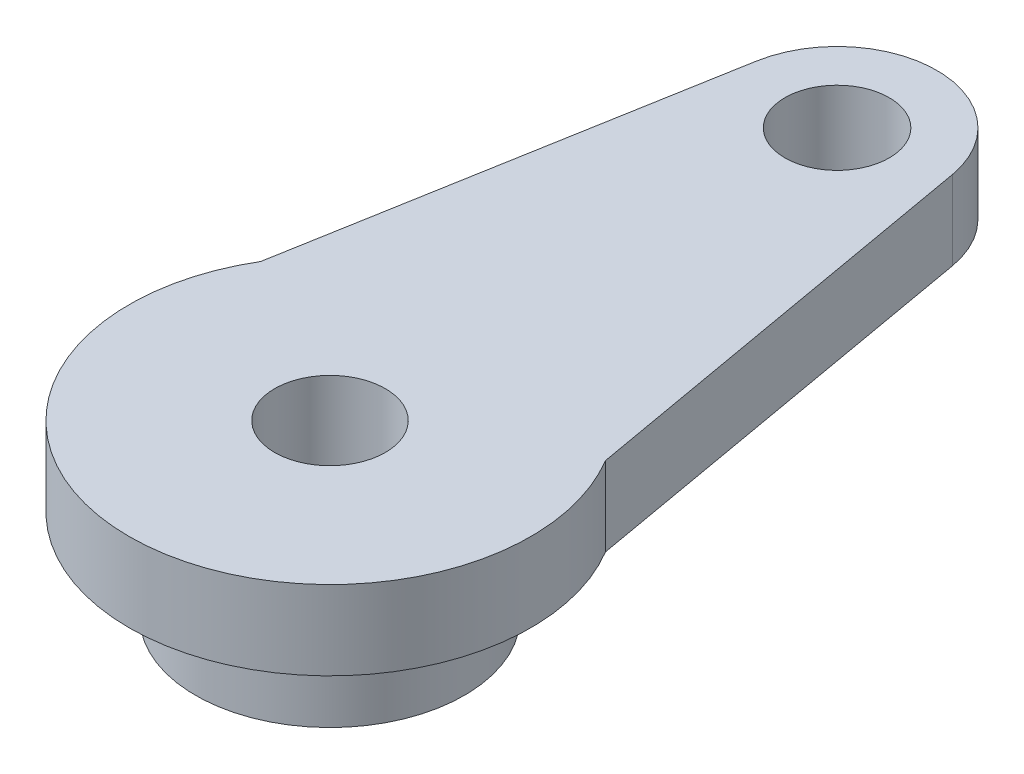
ISO-10303-21;
HEADER;
FILE_DESCRIPTION(('STEP AP214'),'2;1');
FILE_NAME('part.step','',(''),(''),'','','');
FILE_SCHEMA(('AUTOMOTIVE_DESIGN { 1 0 10303 214 1 1 1 1 }'));
ENDSEC;
DATA;
#1=APPLICATION_CONTEXT('core data for automotive mechanical design processes');
#2=APPLICATION_PROTOCOL_DEFINITION('international standard','automotive_design',2000,#1);
#3=PRODUCT_CONTEXT('',#1,'mechanical');
#4=PRODUCT('Part','Part','',(#3));
#5=PRODUCT_RELATED_PRODUCT_CATEGORY('part','',(#4));
#6=PRODUCT_DEFINITION_FORMATION('','',#4);
#7=PRODUCT_DEFINITION_CONTEXT('part definition',#1,'design');
#8=PRODUCT_DEFINITION('design','',#6,#7);
#9=PRODUCT_DEFINITION_SHAPE('','',#8);
#10=(LENGTH_UNIT() NAMED_UNIT(*) SI_UNIT(.MILLI.,.METRE.));
#11=(NAMED_UNIT(*) PLANE_ANGLE_UNIT() SI_UNIT($,.RADIAN.));
#12=(NAMED_UNIT(*) SI_UNIT($,.STERADIAN.) SOLID_ANGLE_UNIT());
#13=UNCERTAINTY_MEASURE_WITH_UNIT(LENGTH_MEASURE(1.E-05),#10,'distance_accuracy_value','');
#14=(GEOMETRIC_REPRESENTATION_CONTEXT(3) GLOBAL_UNCERTAINTY_ASSIGNED_CONTEXT((#13)) GLOBAL_UNIT_ASSIGNED_CONTEXT((#10,
#11,#12)) REPRESENTATION_CONTEXT('',''));
#15=CARTESIAN_POINT('',(0.,0.,0.));
#16=DIRECTION('',(0.,0.,1.));
#17=DIRECTION('',(1.,0.,0.));
#18=AXIS2_PLACEMENT_3D('',#15,#16,#17);
#19=CARTESIAN_POINT('',(0.,0.,0.));
#20=DIRECTION('',(0.,1.,0.));
#21=DIRECTION('',(0.,0.,1.));
#22=AXIS2_PLACEMENT_3D('',#19,#20,#21);
#23=PLANE('',#22);
#24=CARTESIAN_POINT('',(0.,0.,0.));
#25=DIRECTION('',(0.,-1.,0.));
#26=DIRECTION('',(0.,0.,-1.));
#27=AXIS2_PLACEMENT_3D('',#24,#25,#26);
#28=CIRCLE('',#27,3.025);
#29=CARTESIAN_POINT('',(0.,0.,-3.025));
#30=VERTEX_POINT('',#29);
#31=EDGE_CURVE('E174',#30,#30,#28,.T.);
#32=ORIENTED_EDGE('',*,*,#31,.F.);
#33=EDGE_LOOP('',(#32));
#34=FACE_BOUND('',#33,.T.);
#35=CARTESIAN_POINT('',(0.,0.,0.));
#36=DIRECTION('',(0.,-1.,0.));
#37=DIRECTION('',(0.,0.,-1.));
#38=AXIS2_PLACEMENT_3D('',#35,#36,#37);
#39=CIRCLE('',#38,4.25);
#40=CARTESIAN_POINT('',(0.,0.,-4.25));
#41=VERTEX_POINT('',#40);
#42=EDGE_CURVE('E101',#41,#41,#39,.T.);
#43=ORIENTED_EDGE('',*,*,#42,.T.);
#44=EDGE_LOOP('',(#43));
#45=FACE_BOUND('',#44,.T.);
#46=ADVANCED_FACE('F41',(#34,#45),#23,.F.);
#47=CARTESIAN_POINT('',(0.,5.4,0.));
#48=DIRECTION('',(0.,-1.,0.));
#49=DIRECTION('',(0.,0.,-1.));
#50=AXIS2_PLACEMENT_3D('',#47,#48,#49);
#51=CYLINDRICAL_SURFACE('',#50,6.35);
#52=DIRECTION('',(0.,1.,0.));
#53=VECTOR('',#52,1.);
#54=CARTESIAN_POINT('',(-5.45070200344737,2.9,-3.25765984559696));
#55=LINE('',#54,#53);
#56=CARTESIAN_POINT('',(-5.45070200344737,2.9,-3.25765984559696));
#57=VERTEX_POINT('',#56);
#58=CARTESIAN_POINT('',(-5.45070200344738,5.4,-3.25765984559695));
#59=VERTEX_POINT('',#58);
#60=EDGE_CURVE('E97',#57,#59,#55,.T.);
#61=ORIENTED_EDGE('',*,*,#60,.F.);
#62=CARTESIAN_POINT('',(0.,2.9,0.));
#63=DIRECTION('',(0.,1.,0.));
#64=DIRECTION('',(0.,0.,1.));
#65=AXIS2_PLACEMENT_3D('',#62,#63,#64);
#66=CIRCLE('',#65,6.35);
#67=CARTESIAN_POINT('',(5.45070200344738,2.9,-3.25765984559695));
#68=VERTEX_POINT('',#67);
#69=EDGE_CURVE('E93',#68,#57,#66,.F.);
#70=ORIENTED_EDGE('',*,*,#69,.F.);
#71=DIRECTION('',(0.,1.,0.));
#72=VECTOR('',#71,1.);
#73=CARTESIAN_POINT('',(5.45070200344737,2.9,-3.25765984559696));
#74=LINE('',#73,#72);
#75=CARTESIAN_POINT('',(5.45070200344737,5.4,-3.25765984559696));
#76=VERTEX_POINT('',#75);
#77=EDGE_CURVE('E96',#68,#76,#74,.T.);
#78=ORIENTED_EDGE('',*,*,#77,.T.);
#79=CARTESIAN_POINT('',(0.,5.4,0.));
#80=DIRECTION('',(0.,1.,0.));
#81=DIRECTION('',(0.,0.,1.));
#82=AXIS2_PLACEMENT_3D('',#79,#80,#81);
#83=CIRCLE('',#82,6.35);
#84=EDGE_CURVE('E11',#59,#76,#83,.T.);
#85=ORIENTED_EDGE('',*,*,#84,.F.);
#86=EDGE_LOOP('',(#61,#70,#78,#85));
#87=FACE_BOUND('',#86,.T.);
#88=ADVANCED_FACE('F43',(#87),#51,.T.);
#89=CARTESIAN_POINT('',(0.,5.4,0.));
#90=DIRECTION('',(0.,1.,0.));
#91=DIRECTION('',(0.,0.,1.));
#92=AXIS2_PLACEMENT_3D('',#89,#90,#91);
#93=PLANE('',#92);
#94=CARTESIAN_POINT('',(0.,5.4,-16.03));
#95=DIRECTION('',(0.,1.,0.));
#96=DIRECTION('',(0.,0.,1.));
#97=AXIS2_PLACEMENT_3D('',#94,#95,#96);
#98=CIRCLE('',#97,1.65);
#99=CARTESIAN_POINT('',(0.,5.4,-14.38));
#100=VERTEX_POINT('',#99);
#101=EDGE_CURVE('E137',#100,#100,#98,.T.);
#102=ORIENTED_EDGE('',*,*,#101,.F.);
#103=EDGE_LOOP('',(#102));
#104=FACE_BOUND('',#103,.T.);
#105=CARTESIAN_POINT('',(0.,5.4,0.));
#106=DIRECTION('',(0.,1.,0.));
#107=DIRECTION('',(0.,0.,1.));
#108=AXIS2_PLACEMENT_3D('',#105,#106,#107);
#109=CIRCLE('',#108,1.75);
#110=CARTESIAN_POINT('',(0.,5.4,1.75));
#111=VERTEX_POINT('',#110);
#112=EDGE_CURVE('E51',#111,#111,#109,.T.);
#113=ORIENTED_EDGE('',*,*,#112,.F.);
#114=EDGE_LOOP('',(#113));
#115=FACE_BOUND('',#114,.T.);
#116=ORIENTED_EDGE('',*,*,#84,.T.);
#117=DIRECTION('',(-0.173648177666923,0.,-0.984807753012209));
#118=VECTOR('',#117,1.);
#119=CARTESIAN_POINT('',(3.10214442198846,5.4,-16.5769917596508));
#120=LINE('',#119,#118);
#121=CARTESIAN_POINT('',(3.10214442198846,5.4,-16.5769917596508));
#122=VERTEX_POINT('',#121);
#123=EDGE_CURVE('E106',#76,#122,#120,.T.);
#124=ORIENTED_EDGE('',*,*,#123,.T.);
#125=CARTESIAN_POINT('',(0.,5.4,-16.03));
#126=DIRECTION('',(0.,1.,0.));
#127=DIRECTION('',(0.,0.,1.));
#128=AXIS2_PLACEMENT_3D('',#125,#126,#127);
#129=CIRCLE('',#128,3.15);
#130=CARTESIAN_POINT('',(-3.10214442198846,5.4,-16.5769917596508));
#131=VERTEX_POINT('',#130);
#132=EDGE_CURVE('E121',#122,#131,#129,.T.);
#133=ORIENTED_EDGE('',*,*,#132,.T.);
#134=DIRECTION('',(-0.173648177666923,0.,0.984807753012209));
#135=VECTOR('',#134,1.);
#136=CARTESIAN_POINT('',(-3.10214442198846,5.4,-16.5769917596508));
#137=LINE('',#136,#135);
#138=EDGE_CURVE('E58',#131,#59,#137,.T.);
#139=ORIENTED_EDGE('',*,*,#138,.T.);
#140=EDGE_LOOP('',(#116,#124,#133,#139));
#141=FACE_BOUND('',#140,.T.);
#142=ADVANCED_FACE('F152',(#104,#115,#141),#93,.T.);
#143=CARTESIAN_POINT('',(0.,0.,0.));
#144=DIRECTION('',(0.,1.,0.));
#145=DIRECTION('',(0.,0.,1.));
#146=AXIS2_PLACEMENT_3D('',#143,#144,#145);
#147=CYLINDRICAL_SURFACE('',#146,1.75);
#148=CARTESIAN_POINT('',(0.,2.9,0.));
#149=DIRECTION('',(0.,1.,0.));
#150=DIRECTION('',(0.,0.,1.));
#151=AXIS2_PLACEMENT_3D('',#148,#149,#150);
#152=CIRCLE('',#151,1.75);
#153=CARTESIAN_POINT('',(0.,2.9,1.75));
#154=VERTEX_POINT('',#153);
#155=EDGE_CURVE('E45',#154,#154,#152,.F.);
#156=CARTESIAN_POINT('',(0.,2.9,1.75));
#157=CARTESIAN_POINT('',(0.,2.92604166666667,1.75));
#158=CARTESIAN_POINT('',(0.,2.95208333333333,1.75));
#159=CARTESIAN_POINT('',(0.,3.00416666666667,1.75));
#160=CARTESIAN_POINT('',(0.,3.03020833333333,1.75));
#161=CARTESIAN_POINT('',(0.,3.08229166666667,1.75));
#162=CARTESIAN_POINT('',(0.,3.10833333333333,1.75));
#163=CARTESIAN_POINT('',(0.,3.16041666666667,1.75));
#164=CARTESIAN_POINT('',(0.,3.18645833333333,1.75));
#165=CARTESIAN_POINT('',(0.,3.23854166666667,1.75));
#166=CARTESIAN_POINT('',(0.,3.26458333333333,1.75));
#167=CARTESIAN_POINT('',(0.,3.31666666666667,1.75));
#168=CARTESIAN_POINT('',(0.,3.34270833333333,1.75));
#169=CARTESIAN_POINT('',(0.,3.39479166666667,1.75));
#170=CARTESIAN_POINT('',(0.,3.42083333333333,1.75));
#171=CARTESIAN_POINT('',(0.,3.47291666666667,1.75));
#172=CARTESIAN_POINT('',(0.,3.49895833333333,1.75));
#173=CARTESIAN_POINT('',(0.,3.55104166666667,1.75));
#174=CARTESIAN_POINT('',(0.,3.57708333333333,1.75));
#175=CARTESIAN_POINT('',(0.,3.62916666666667,1.75));
#176=CARTESIAN_POINT('',(0.,3.65520833333333,1.75));
#177=CARTESIAN_POINT('',(0.,3.70729166666667,1.75));
#178=CARTESIAN_POINT('',(0.,3.73333333333333,1.75));
#179=CARTESIAN_POINT('',(0.,3.78541666666667,1.75));
#180=CARTESIAN_POINT('',(0.,3.81145833333333,1.75));
#181=CARTESIAN_POINT('',(0.,3.86354166666667,1.75));
#182=CARTESIAN_POINT('',(0.,3.88958333333333,1.75));
#183=CARTESIAN_POINT('',(0.,3.94166666666667,1.75));
#184=CARTESIAN_POINT('',(0.,3.96770833333333,1.75));
#185=CARTESIAN_POINT('',(0.,4.01979166666667,1.75));
#186=CARTESIAN_POINT('',(0.,4.04583333333333,1.75));
#187=CARTESIAN_POINT('',(0.,4.09791666666667,1.75));
#188=CARTESIAN_POINT('',(0.,4.12395833333333,1.75));
#189=CARTESIAN_POINT('',(0.,4.17604166666667,1.75));
#190=CARTESIAN_POINT('',(0.,4.20208333333333,1.75));
#191=CARTESIAN_POINT('',(0.,4.25416666666667,1.75));
#192=CARTESIAN_POINT('',(0.,4.28020833333333,1.75));
#193=CARTESIAN_POINT('',(0.,4.33229166666667,1.75));
#194=CARTESIAN_POINT('',(0.,4.35833333333333,1.75));
#195=CARTESIAN_POINT('',(0.,4.41041666666667,1.75));
#196=CARTESIAN_POINT('',(0.,4.43645833333333,1.75));
#197=CARTESIAN_POINT('',(0.,4.48854166666667,1.75));
#198=CARTESIAN_POINT('',(0.,4.51458333333333,1.75));
#199=CARTESIAN_POINT('',(0.,4.56666666666667,1.75));
#200=CARTESIAN_POINT('',(0.,4.59270833333333,1.75));
#201=CARTESIAN_POINT('',(0.,4.64479166666667,1.75));
#202=CARTESIAN_POINT('',(0.,4.67083333333333,1.75));
#203=CARTESIAN_POINT('',(0.,4.72291666666667,1.75));
#204=CARTESIAN_POINT('',(0.,4.74895833333333,1.75));
#205=CARTESIAN_POINT('',(0.,4.80104166666667,1.75));
#206=CARTESIAN_POINT('',(0.,4.82708333333333,1.75));
#207=CARTESIAN_POINT('',(0.,4.87916666666667,1.75));
#208=CARTESIAN_POINT('',(0.,4.90520833333333,1.75));
#209=CARTESIAN_POINT('',(0.,4.95729166666667,1.75));
#210=CARTESIAN_POINT('',(0.,4.98333333333333,1.75));
#211=CARTESIAN_POINT('',(0.,5.03541666666667,1.75));
#212=CARTESIAN_POINT('',(0.,5.06145833333333,1.75));
#213=CARTESIAN_POINT('',(0.,5.11354166666667,1.75));
#214=CARTESIAN_POINT('',(0.,5.13958333333333,1.75));
#215=CARTESIAN_POINT('',(0.,5.19166666666667,1.75));
#216=CARTESIAN_POINT('',(0.,5.21770833333333,1.75));
#217=CARTESIAN_POINT('',(0.,5.26979166666667,1.75));
#218=CARTESIAN_POINT('',(0.,5.29583333333333,1.75));
#219=CARTESIAN_POINT('',(0.,5.34791666666667,1.75));
#220=CARTESIAN_POINT('',(0.,5.37395833333333,1.75));
#221=CARTESIAN_POINT('',(0.,5.4,1.75));
#222=B_SPLINE_CURVE_WITH_KNOTS('',3,(#156,#157,#158,#159,#160,#161,#162,#163,#164,#165,#166,
#167,#168,#169,#170,#171,#172,#173,#174,#175,#176,#177,#178,#179,#180,#181,#182,#183,#184,#185,
#186,#187,#188,#189,#190,#191,#192,#193,#194,#195,#196,#197,#198,#199,#200,#201,#202,#203,#204,
#205,#206,#207,#208,#209,#210,#211,#212,#213,#214,#215,#216,#217,#218,#219,#220,#221),
.UNSPECIFIED.,.F.,.F.,(4,2,2,2,2,2,2,2,2,2,2,2,2,2,2,2,2,2,2,2,2,2,2,2,2,2,2,2,2,2,2,2,4),(0.,
0.0781250000000001,0.15625,0.234375,0.3125,0.390625,0.46875,0.546875,0.625,0.703125,0.78125,
0.859375,0.9375,1.015625,1.09375,1.171875,1.25,1.328125,1.40625,1.484375,1.5625,1.640625,
1.71875,1.796875,1.875,1.953125,2.03125,2.109375,2.1875,2.265625,2.34375,2.421875,2.5),.UNSPECIFIED.);
#223=EDGE_CURVE('BSEAM154',#154,#111,#222,.T.);
#224=ORIENTED_EDGE('',*,*,#155,.T.);
#225=ORIENTED_EDGE('',*,*,#112,.T.);
#226=ORIENTED_EDGE('',*,*,#223,.T.);
#227=ORIENTED_EDGE('',*,*,#223,.F.);
#228=EDGE_LOOP('',(#224,#226,#225,#227));
#229=FACE_BOUND('',#228,.T.);
#230=ADVANCED_FACE('F154',(#229),#147,.F.);
#231=CARTESIAN_POINT('',(0.,2.9,-16.03));
#232=DIRECTION('',(0.,1.,0.));
#233=DIRECTION('',(0.,0.,1.));
#234=AXIS2_PLACEMENT_3D('',#231,#232,#233);
#235=CYLINDRICAL_SURFACE('',#234,3.15);
#236=ORIENTED_EDGE('',*,*,#132,.F.);
#237=DIRECTION('',(0.,1.,0.));
#238=VECTOR('',#237,1.);
#239=CARTESIAN_POINT('',(3.10214442198846,2.9,-16.5769917596508));
#240=LINE('',#239,#238);
#241=CARTESIAN_POINT('',(3.10214442198846,2.9,-16.5769917596508));
#242=VERTEX_POINT('',#241);
#243=EDGE_CURVE('E67',#242,#122,#240,.T.);
#244=ORIENTED_EDGE('',*,*,#243,.F.);
#245=CARTESIAN_POINT('',(0.,2.9,-16.03));
#246=DIRECTION('',(0.,1.,0.));
#247=DIRECTION('',(0.,0.,1.));
#248=AXIS2_PLACEMENT_3D('',#245,#246,#247);
#249=CIRCLE('',#248,3.15);
#250=CARTESIAN_POINT('',(-3.10214442198846,2.9,-16.5769917596508));
#251=VERTEX_POINT('',#250);
#252=EDGE_CURVE('E111',#242,#251,#249,.T.);
#253=ORIENTED_EDGE('',*,*,#252,.T.);
#254=DIRECTION('',(0.,1.,0.));
#255=VECTOR('',#254,1.);
#256=CARTESIAN_POINT('',(-3.10214442198846,2.9,-16.5769917596508));
#257=LINE('',#256,#255);
#258=EDGE_CURVE('E86',#251,#131,#257,.T.);
#259=ORIENTED_EDGE('',*,*,#258,.T.);
#260=EDGE_LOOP('',(#236,#244,#253,#259));
#261=FACE_BOUND('',#260,.T.);
#262=ADVANCED_FACE('F150',(#261),#235,.T.);
#263=CARTESIAN_POINT('',(3.10214442198846,2.9,-16.5769917596508));
#264=DIRECTION('',(0.984807753012209,0.,-0.173648177666923));
#265=DIRECTION('',(-0.173648177666923,0.,-0.984807753012209));
#266=AXIS2_PLACEMENT_3D('',#263,#264,#265);
#267=PLANE('',#266);
#268=ORIENTED_EDGE('',*,*,#123,.F.);
#269=ORIENTED_EDGE('',*,*,#77,.F.);
#270=DIRECTION('',(-0.173648177666923,0.,-0.984807753012209));
#271=VECTOR('',#270,1.);
#272=CARTESIAN_POINT('',(3.10214442198846,2.9,-16.5769917596508));
#273=LINE('',#272,#271);
#274=EDGE_CURVE('E104',#68,#242,#273,.T.);
#275=ORIENTED_EDGE('',*,*,#274,.T.);
#276=ORIENTED_EDGE('',*,*,#243,.T.);
#277=EDGE_LOOP('',(#268,#269,#275,#276));
#278=FACE_BOUND('',#277,.T.);
#279=ADVANCED_FACE('F103',(#278),#267,.T.);
#280=CARTESIAN_POINT('',(-3.10214442198846,2.9,-16.5769917596508));
#281=DIRECTION('',(-0.984807753012209,0.,-0.173648177666923));
#282=DIRECTION('',(-0.173648177666923,0.,0.984807753012209));
#283=AXIS2_PLACEMENT_3D('',#280,#281,#282);
#284=PLANE('',#283);
#285=ORIENTED_EDGE('',*,*,#138,.F.);
#286=ORIENTED_EDGE('',*,*,#258,.F.);
#287=DIRECTION('',(-0.173648177666923,0.,0.984807753012209));
#288=VECTOR('',#287,1.);
#289=CARTESIAN_POINT('',(-3.10214442198846,2.9,-16.5769917596508));
#290=LINE('',#289,#288);
#291=EDGE_CURVE('E113',#251,#57,#290,.T.);
#292=ORIENTED_EDGE('',*,*,#291,.T.);
#293=ORIENTED_EDGE('',*,*,#60,.T.);
#294=EDGE_LOOP('',(#285,#286,#292,#293));
#295=FACE_BOUND('',#294,.T.);
#296=ADVANCED_FACE('F151',(#295),#284,.T.);
#297=CARTESIAN_POINT('',(0.,2.9,-16.03));
#298=DIRECTION('',(0.,1.,0.));
#299=DIRECTION('',(0.,0.,1.));
#300=AXIS2_PLACEMENT_3D('',#297,#298,#299);
#301=PLANE('',#300);
#302=CARTESIAN_POINT('',(0.,2.9,-16.03));
#303=DIRECTION('',(0.,1.,0.));
#304=DIRECTION('',(0.,0.,1.));
#305=AXIS2_PLACEMENT_3D('',#302,#303,#304);
#306=CIRCLE('',#305,1.65);
#307=CARTESIAN_POINT('',(0.,2.9,-14.38));
#308=VERTEX_POINT('',#307);
#309=EDGE_CURVE('E124',#308,#308,#306,.T.);
#310=ORIENTED_EDGE('',*,*,#309,.T.);
#311=EDGE_LOOP('',(#310));
#312=FACE_BOUND('',#311,.T.);
#313=ORIENTED_EDGE('',*,*,#252,.F.);
#314=ORIENTED_EDGE('',*,*,#274,.F.);
#315=ORIENTED_EDGE('',*,*,#69,.T.);
#316=ORIENTED_EDGE('',*,*,#291,.F.);
#317=EDGE_LOOP('',(#313,#314,#315,#316));
#318=FACE_BOUND('',#317,.T.);
#319=CARTESIAN_POINT('',(0.,2.9,0.));
#320=DIRECTION('',(0.,1.,0.));
#321=DIRECTION('',(0.,0.,1.));
#322=AXIS2_PLACEMENT_3D('',#319,#320,#321);
#323=CIRCLE('',#322,4.25);
#324=CARTESIAN_POINT('',(0.,2.9,-4.25));
#325=VERTEX_POINT('',#324);
#326=EDGE_CURVE('E142',#325,#325,#323,.F.);
#327=ORIENTED_EDGE('',*,*,#326,.F.);
#328=EDGE_LOOP('',(#327));
#329=FACE_BOUND('',#328,.T.);
#330=ADVANCED_FACE('F109',(#312,#318,#329),#301,.F.);
#331=CARTESIAN_POINT('',(0.,0.,-16.03));
#332=DIRECTION('',(0.,1.,0.));
#333=DIRECTION('',(0.,0.,1.));
#334=AXIS2_PLACEMENT_3D('',#331,#332,#333);
#335=CYLINDRICAL_SURFACE('',#334,1.65);
#336=CARTESIAN_POINT('',(0.,5.4,-14.38));
#337=CARTESIAN_POINT('',(0.,5.37395833333333,-14.38));
#338=CARTESIAN_POINT('',(0.,5.34791666666667,-14.38));
#339=CARTESIAN_POINT('',(0.,5.29583333333333,-14.38));
#340=CARTESIAN_POINT('',(0.,5.26979166666667,-14.38));
#341=CARTESIAN_POINT('',(0.,5.21770833333333,-14.38));
#342=CARTESIAN_POINT('',(0.,5.19166666666667,-14.38));
#343=CARTESIAN_POINT('',(0.,5.13958333333333,-14.38));
#344=CARTESIAN_POINT('',(0.,5.11354166666667,-14.38));
#345=CARTESIAN_POINT('',(0.,5.06145833333333,-14.38));
#346=CARTESIAN_POINT('',(0.,5.03541666666667,-14.38));
#347=CARTESIAN_POINT('',(0.,4.98333333333333,-14.38));
#348=CARTESIAN_POINT('',(0.,4.95729166666667,-14.38));
#349=CARTESIAN_POINT('',(0.,4.90520833333333,-14.38));
#350=CARTESIAN_POINT('',(0.,4.87916666666667,-14.38));
#351=CARTESIAN_POINT('',(0.,4.82708333333333,-14.38));
#352=CARTESIAN_POINT('',(0.,4.80104166666667,-14.38));
#353=CARTESIAN_POINT('',(0.,4.74895833333333,-14.38));
#354=CARTESIAN_POINT('',(0.,4.72291666666667,-14.38));
#355=CARTESIAN_POINT('',(0.,4.67083333333333,-14.38));
#356=CARTESIAN_POINT('',(0.,4.64479166666667,-14.38));
#357=CARTESIAN_POINT('',(0.,4.59270833333333,-14.38));
#358=CARTESIAN_POINT('',(0.,4.56666666666667,-14.38));
#359=CARTESIAN_POINT('',(0.,4.51458333333333,-14.38));
#360=CARTESIAN_POINT('',(0.,4.48854166666667,-14.38));
#361=CARTESIAN_POINT('',(0.,4.43645833333333,-14.38));
#362=CARTESIAN_POINT('',(0.,4.41041666666667,-14.38));
#363=CARTESIAN_POINT('',(0.,4.35833333333333,-14.38));
#364=CARTESIAN_POINT('',(0.,4.33229166666667,-14.38));
#365=CARTESIAN_POINT('',(0.,4.28020833333333,-14.38));
#366=CARTESIAN_POINT('',(0.,4.25416666666667,-14.38));
#367=CARTESIAN_POINT('',(0.,4.20208333333333,-14.38));
#368=CARTESIAN_POINT('',(0.,4.17604166666667,-14.38));
#369=CARTESIAN_POINT('',(0.,4.12395833333333,-14.38));
#370=CARTESIAN_POINT('',(0.,4.09791666666667,-14.38));
#371=CARTESIAN_POINT('',(0.,4.04583333333333,-14.38));
#372=CARTESIAN_POINT('',(0.,4.01979166666667,-14.38));
#373=CARTESIAN_POINT('',(0.,3.96770833333333,-14.38));
#374=CARTESIAN_POINT('',(0.,3.94166666666667,-14.38));
#375=CARTESIAN_POINT('',(0.,3.88958333333333,-14.38));
#376=CARTESIAN_POINT('',(0.,3.86354166666667,-14.38));
#377=CARTESIAN_POINT('',(0.,3.81145833333333,-14.38));
#378=CARTESIAN_POINT('',(0.,3.78541666666667,-14.38));
#379=CARTESIAN_POINT('',(0.,3.73333333333333,-14.38));
#380=CARTESIAN_POINT('',(0.,3.70729166666667,-14.38));
#381=CARTESIAN_POINT('',(0.,3.65520833333333,-14.38));
#382=CARTESIAN_POINT('',(0.,3.62916666666667,-14.38));
#383=CARTESIAN_POINT('',(0.,3.57708333333333,-14.38));
#384=CARTESIAN_POINT('',(0.,3.55104166666667,-14.38));
#385=CARTESIAN_POINT('',(0.,3.49895833333333,-14.38));
#386=CARTESIAN_POINT('',(0.,3.47291666666667,-14.38));
#387=CARTESIAN_POINT('',(0.,3.42083333333333,-14.38));
#388=CARTESIAN_POINT('',(0.,3.39479166666667,-14.38));
#389=CARTESIAN_POINT('',(0.,3.34270833333333,-14.38));
#390=CARTESIAN_POINT('',(0.,3.31666666666667,-14.38));
#391=CARTESIAN_POINT('',(0.,3.26458333333333,-14.38));
#392=CARTESIAN_POINT('',(0.,3.23854166666667,-14.38));
#393=CARTESIAN_POINT('',(0.,3.18645833333333,-14.38));
#394=CARTESIAN_POINT('',(0.,3.16041666666667,-14.38));
#395=CARTESIAN_POINT('',(0.,3.10833333333333,-14.38));
#396=CARTESIAN_POINT('',(0.,3.08229166666667,-14.38));
#397=CARTESIAN_POINT('',(0.,3.03020833333333,-14.38));
#398=CARTESIAN_POINT('',(0.,3.00416666666667,-14.38));
#399=CARTESIAN_POINT('',(0.,2.95208333333333,-14.38));
#400=CARTESIAN_POINT('',(0.,2.92604166666667,-14.38));
#401=CARTESIAN_POINT('',(0.,2.9,-14.38));
#402=B_SPLINE_CURVE_WITH_KNOTS('',3,(#336,#337,#338,#339,#340,#341,#342,#343,#344,#345,#346,
#347,#348,#349,#350,#351,#352,#353,#354,#355,#356,#357,#358,#359,#360,#361,#362,#363,#364,#365,
#366,#367,#368,#369,#370,#371,#372,#373,#374,#375,#376,#377,#378,#379,#380,#381,#382,#383,#384,
#385,#386,#387,#388,#389,#390,#391,#392,#393,#394,#395,#396,#397,#398,#399,#400,#401),
.UNSPECIFIED.,.F.,.F.,(4,2,2,2,2,2,2,2,2,2,2,2,2,2,2,2,2,2,2,2,2,2,2,2,2,2,2,2,2,2,2,2,4),(0.,
0.0781250000000001,0.15625,0.234375,0.3125,0.390625,0.46875,0.546875,0.625,0.703125,0.78125,
0.859375,0.9375,1.015625,1.09375,1.171875,1.25,1.328125,1.40625,1.484375,1.5625,1.640625,
1.71875,1.796875,1.875,1.953125,2.03125,2.109375,2.1875,2.265625,2.34375,2.421875,2.5),.UNSPECIFIED.);
#403=EDGE_CURVE('BSEAM206',#100,#308,#402,.T.);
#404=ORIENTED_EDGE('',*,*,#101,.T.);
#405=ORIENTED_EDGE('',*,*,#309,.F.);
#406=ORIENTED_EDGE('',*,*,#403,.T.);
#407=ORIENTED_EDGE('',*,*,#403,.F.);
#408=EDGE_LOOP('',(#404,#406,#405,#407));
#409=FACE_BOUND('',#408,.T.);
#410=ADVANCED_FACE('F206',(#409),#335,.F.);
#411=CARTESIAN_POINT('',(0.,20.8605122421383,0.));
#412=DIRECTION('',(0.,-1.,0.));
#413=DIRECTION('',(0.,0.,-1.));
#414=AXIS2_PLACEMENT_3D('',#411,#412,#413);
#415=CYLINDRICAL_SURFACE('',#414,4.25);
#416=CARTESIAN_POINT('',(0.,0.,-4.25));
#417=CARTESIAN_POINT('',(0.,0.0302083333333369,-4.25));
#418=CARTESIAN_POINT('',(0.,0.0604166666666704,-4.25));
#419=CARTESIAN_POINT('',(0.,0.120833333333337,-4.25));
#420=CARTESIAN_POINT('',(0.,0.151041666666671,-4.25));
#421=CARTESIAN_POINT('',(0.,0.211458333333337,-4.25));
#422=CARTESIAN_POINT('',(0.,0.241666666666669,-4.25));
#423=CARTESIAN_POINT('',(0.,0.302083333333335,-4.25));
#424=CARTESIAN_POINT('',(0.,0.332291666666668,-4.25));
#425=CARTESIAN_POINT('',(0.,0.392708333333335,-4.25));
#426=CARTESIAN_POINT('',(0.,0.422916666666669,-4.25));
#427=CARTESIAN_POINT('',(0.,0.483333333333336,-4.25));
#428=CARTESIAN_POINT('',(0.,0.513541666666669,-4.25));
#429=CARTESIAN_POINT('',(0.,0.573958333333336,-4.25));
#430=CARTESIAN_POINT('',(0.,0.60416666666667,-4.25));
#431=CARTESIAN_POINT('',(0.,0.664583333333335,-4.25));
#432=CARTESIAN_POINT('',(0.,0.694791666666668,-4.25));
#433=CARTESIAN_POINT('',(0.,0.755208333333333,-4.25));
#434=CARTESIAN_POINT('',(0.,0.785416666666667,-4.25));
#435=CARTESIAN_POINT('',(0.,0.845833333333334,-4.25));
#436=CARTESIAN_POINT('',(0.,0.876041666666667,-4.25));
#437=CARTESIAN_POINT('',(0.,0.936458333333334,-4.25));
#438=CARTESIAN_POINT('',(0.,0.966666666666668,-4.25));
#439=CARTESIAN_POINT('',(0.,1.02708333333333,-4.25));
#440=CARTESIAN_POINT('',(0.,1.05729166666667,-4.25));
#441=CARTESIAN_POINT('',(0.,1.11770833333334,-4.25));
#442=CARTESIAN_POINT('',(0.,1.14791666666667,-4.25));
#443=CARTESIAN_POINT('',(0.,1.20833333333333,-4.25));
#444=CARTESIAN_POINT('',(0.,1.23854166666667,-4.25));
#445=CARTESIAN_POINT('',(0.,1.29895833333333,-4.25));
#446=CARTESIAN_POINT('',(0.,1.32916666666667,-4.25));
#447=CARTESIAN_POINT('',(0.,1.38958333333333,-4.25));
#448=CARTESIAN_POINT('',(0.,1.41979166666667,-4.25));
#449=CARTESIAN_POINT('',(0.,1.48020833333333,-4.25));
#450=CARTESIAN_POINT('',(0.,1.51041666666667,-4.25));
#451=CARTESIAN_POINT('',(0.,1.57083333333333,-4.25));
#452=CARTESIAN_POINT('',(0.,1.60104166666667,-4.25));
#453=CARTESIAN_POINT('',(0.,1.66145833333333,-4.25));
#454=CARTESIAN_POINT('',(0.,1.69166666666667,-4.25));
#455=CARTESIAN_POINT('',(0.,1.75208333333333,-4.25));
#456=CARTESIAN_POINT('',(0.,1.78229166666666,-4.25));
#457=CARTESIAN_POINT('',(0.,1.84270833333333,-4.25));
#458=CARTESIAN_POINT('',(0.,1.87291666666667,-4.25));
#459=CARTESIAN_POINT('',(0.,1.93333333333333,-4.25));
#460=CARTESIAN_POINT('',(0.,1.96354166666667,-4.25));
#461=CARTESIAN_POINT('',(0.,2.02395833333333,-4.25));
#462=CARTESIAN_POINT('',(0.,2.05416666666667,-4.25));
#463=CARTESIAN_POINT('',(0.,2.11458333333333,-4.25));
#464=CARTESIAN_POINT('',(0.,2.14479166666667,-4.25));
#465=CARTESIAN_POINT('',(0.,2.20520833333333,-4.25));
#466=CARTESIAN_POINT('',(0.,2.23541666666666,-4.25));
#467=CARTESIAN_POINT('',(0.,2.29583333333333,-4.25));
#468=CARTESIAN_POINT('',(0.,2.32604166666666,-4.25));
#469=CARTESIAN_POINT('',(0.,2.38645833333333,-4.25));
#470=CARTESIAN_POINT('',(0.,2.41666666666666,-4.25));
#471=CARTESIAN_POINT('',(0.,2.47708333333333,-4.25));
#472=CARTESIAN_POINT('',(0.,2.50729166666666,-4.25));
#473=CARTESIAN_POINT('',(0.,2.56770833333333,-4.25));
#474=CARTESIAN_POINT('',(0.,2.59791666666667,-4.25));
#475=CARTESIAN_POINT('',(0.,2.65833333333333,-4.25));
#476=CARTESIAN_POINT('',(0.,2.68854166666666,-4.25));
#477=CARTESIAN_POINT('',(0.,2.74895833333333,-4.25));
#478=CARTESIAN_POINT('',(0.,2.77916666666666,-4.25));
#479=CARTESIAN_POINT('',(0.,2.83958333333333,-4.25));
#480=CARTESIAN_POINT('',(0.,2.86979166666666,-4.25));
#481=CARTESIAN_POINT('',(0.,2.9,-4.25));
#482=B_SPLINE_CURVE_WITH_KNOTS('',3,(#416,#417,#418,#419,#420,#421,#422,#423,#424,#425,#426,
#427,#428,#429,#430,#431,#432,#433,#434,#435,#436,#437,#438,#439,#440,#441,#442,#443,#444,#445,
#446,#447,#448,#449,#450,#451,#452,#453,#454,#455,#456,#457,#458,#459,#460,#461,#462,#463,#464,
#465,#466,#467,#468,#469,#470,#471,#472,#473,#474,#475,#476,#477,#478,#479,#480,#481),
.UNSPECIFIED.,.F.,.F.,(4,2,2,2,2,2,2,2,2,2,2,2,2,2,2,2,2,2,2,2,2,2,2,2,2,2,2,2,2,2,2,2,4),(0.,
0.0906250000000004,0.181250000000001,0.271874999999998,0.362499999999998,0.453124999999999,
0.543749999999999,0.634374999999999,0.724999999999997,0.815624999999997,0.906249999999997,
0.996874999999998,1.0875,1.178125,1.26875,1.359375,1.45,1.540625,1.63125,1.72187499999999,
1.81249999999999,1.903125,1.99375,2.084375,2.175,2.26562499999999,2.35624999999999,
2.44687499999999,2.53749999999999,2.62812499999999,2.71874999999999,2.80937499999999,
2.89999999999999),.UNSPECIFIED.);
#483=EDGE_CURVE('BSEAM196',#41,#325,#482,.T.);
#484=ORIENTED_EDGE('',*,*,#42,.F.);
#485=ORIENTED_EDGE('',*,*,#326,.T.);
#486=ORIENTED_EDGE('',*,*,#483,.T.);
#487=ORIENTED_EDGE('',*,*,#483,.F.);
#488=EDGE_LOOP('',(#484,#486,#485,#487));
#489=FACE_BOUND('',#488,.T.);
#490=ADVANCED_FACE('F196',(#489),#415,.T.);
#491=CARTESIAN_POINT('',(0.,2.9,-16.03));
#492=DIRECTION('',(0.,1.,0.));
#493=DIRECTION('',(0.,0.,1.));
#494=AXIS2_PLACEMENT_3D('',#491,#492,#493);
#495=PLANE('',#494);
#496=CARTESIAN_POINT('',(0.,2.9,0.));
#497=DIRECTION('',(0.,1.,0.));
#498=DIRECTION('',(0.,0.,1.));
#499=AXIS2_PLACEMENT_3D('',#496,#497,#498);
#500=CIRCLE('',#499,3.025);
#501=CARTESIAN_POINT('',(0.,2.9,3.025));
#502=VERTEX_POINT('',#501);
#503=EDGE_CURVE('E181',#502,#502,#500,.F.);
#504=ORIENTED_EDGE('',*,*,#503,.T.);
#505=EDGE_LOOP('',(#504));
#506=FACE_BOUND('',#505,.T.);
#507=ORIENTED_EDGE('',*,*,#155,.F.);
#508=EDGE_LOOP('',(#507));
#509=FACE_BOUND('',#508,.T.);
#510=ADVANCED_FACE('F190',(#506,#509),#495,.F.);
#511=CARTESIAN_POINT('',(0.,11.4559920523572,0.));
#512=DIRECTION('',(0.,-1.,0.));
#513=DIRECTION('',(0.,0.,-1.));
#514=AXIS2_PLACEMENT_3D('',#511,#512,#513);
#515=CYLINDRICAL_SURFACE('',#514,3.025);
#516=ORIENTED_EDGE('',*,*,#31,.T.);
#517=EDGE_LOOP('',(#516));
#518=FACE_BOUND('',#517,.T.);
#519=ORIENTED_EDGE('',*,*,#503,.F.);
#520=EDGE_LOOP('',(#519));
#521=FACE_BOUND('',#520,.T.);
#522=ADVANCED_FACE('F187',(#518,#521),#515,.F.);
#523=CLOSED_SHELL('',(#46,#88,#142,#230,#262,#279,#296,#330,#410,#490,#510,#522));
#524=MANIFOLD_SOLID_BREP('B2',#523);
#525=ADVANCED_BREP_SHAPE_REPRESENTATION('',(#18,#524),#14);
#526=SHAPE_DEFINITION_REPRESENTATION(#9,#525);
ENDSEC;
END-ISO-10303-21;
